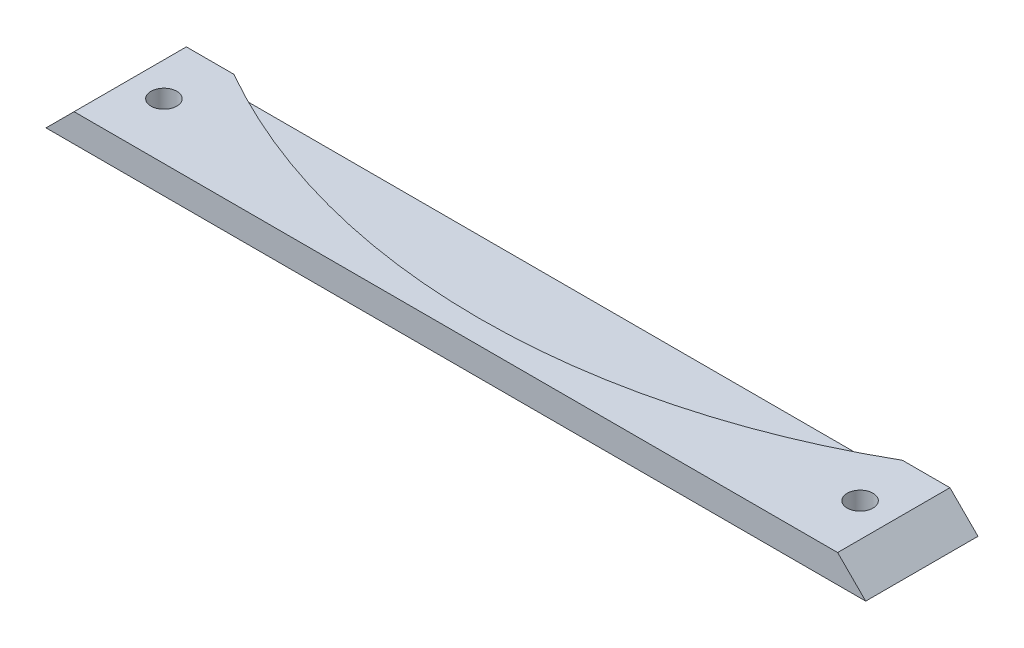
ISO-10303-21;
HEADER;
FILE_DESCRIPTION(('STEP AP214'),'2;1');
FILE_NAME('part.step','',(''),(''),'','','');
FILE_SCHEMA(('AUTOMOTIVE_DESIGN { 1 0 10303 214 1 1 1 1 }'));
ENDSEC;
DATA;
#1=APPLICATION_CONTEXT('core data for automotive mechanical design processes');
#2=APPLICATION_PROTOCOL_DEFINITION('international standard','automotive_design',2000,#1);
#3=PRODUCT_CONTEXT('',#1,'mechanical');
#4=PRODUCT('Part','Part','',(#3));
#5=PRODUCT_RELATED_PRODUCT_CATEGORY('part','',(#4));
#6=PRODUCT_DEFINITION_FORMATION('','',#4);
#7=PRODUCT_DEFINITION_CONTEXT('part definition',#1,'design');
#8=PRODUCT_DEFINITION('design','',#6,#7);
#9=PRODUCT_DEFINITION_SHAPE('','',#8);
#10=(LENGTH_UNIT() NAMED_UNIT(*) SI_UNIT(.MILLI.,.METRE.));
#11=(NAMED_UNIT(*) PLANE_ANGLE_UNIT() SI_UNIT($,.RADIAN.));
#12=(NAMED_UNIT(*) SI_UNIT($,.STERADIAN.) SOLID_ANGLE_UNIT());
#13=UNCERTAINTY_MEASURE_WITH_UNIT(LENGTH_MEASURE(1.E-05),#10,'distance_accuracy_value','');
#14=(GEOMETRIC_REPRESENTATION_CONTEXT(3) GLOBAL_UNCERTAINTY_ASSIGNED_CONTEXT((#13)) GLOBAL_UNIT_ASSIGNED_CONTEXT((#10,
#11,#12)) REPRESENTATION_CONTEXT('',''));
#15=CARTESIAN_POINT('',(0.,0.,0.));
#16=DIRECTION('',(0.,0.,1.));
#17=DIRECTION('',(1.,0.,0.));
#18=AXIS2_PLACEMENT_3D('',#15,#16,#17);
#19=CARTESIAN_POINT('',(-75.,5.,-10.));
#20=DIRECTION('',(0.,0.,1.));
#21=DIRECTION('',(1.,0.,0.));
#22=AXIS2_PLACEMENT_3D('',#19,#20,#21);
#23=PLANE('',#22);
#24=DIRECTION('',(-1.,0.,0.));
#25=VECTOR('',#24,1.);
#26=CARTESIAN_POINT('',(-75.,5.,-10.));
#27=LINE('',#26,#25);
#28=CARTESIAN_POINT('',(67.9999999999999,5.,-10.));
#29=VERTEX_POINT('',#28);
#30=CARTESIAN_POINT('',(59.5442692456629,5.,-9.99999999999999));
#31=VERTEX_POINT('',#30);
#32=EDGE_CURVE('E141',#29,#31,#27,.T.);
#33=ORIENTED_EDGE('',*,*,#32,.F.);
#34=DIRECTION('',(-0.707106781186551,0.707106781186544,0.));
#35=VECTOR('',#34,1.);
#36=CARTESIAN_POINT('',(67.9999999999999,5.,-10.));
#37=LINE('',#36,#35);
#38=CARTESIAN_POINT('',(73.,0.,-10.));
#39=VERTEX_POINT('',#38);
#40=EDGE_CURVE('E121',#29,#39,#37,.F.);
#41=ORIENTED_EDGE('',*,*,#40,.T.);
#42=DIRECTION('',(-1.,0.,0.));
#43=VECTOR('',#42,1.);
#44=CARTESIAN_POINT('',(-75.,0.,-10.));
#45=LINE('',#44,#43);
#46=CARTESIAN_POINT('',(-72.9999999999999,0.,-10.));
#47=VERTEX_POINT('',#46);
#48=EDGE_CURVE('E99',#39,#47,#45,.T.);
#49=ORIENTED_EDGE('',*,*,#48,.T.);
#50=DIRECTION('',(-0.707106781186551,-0.707106781186544,0.));
#51=VECTOR('',#50,1.);
#52=CARTESIAN_POINT('',(-67.9999999999999,5.,-10.));
#53=LINE('',#52,#51);
#54=CARTESIAN_POINT('',(-67.9999999999999,5.,-10.));
#55=VERTEX_POINT('',#54);
#56=EDGE_CURVE('E119',#47,#55,#53,.F.);
#57=ORIENTED_EDGE('',*,*,#56,.T.);
#58=CARTESIAN_POINT('',(-59.5442692456629,5.,-9.99999999999999));
#59=VERTEX_POINT('',#58);
#60=EDGE_CURVE('E138',#59,#55,#27,.T.);
#61=ORIENTED_EDGE('',*,*,#60,.F.);
#62=DIRECTION('',(0.,1.,0.));
#63=VECTOR('',#62,1.);
#64=CARTESIAN_POINT('',(-59.5442692456629,2.,-9.99999999999999));
#65=LINE('',#64,#63);
#66=CARTESIAN_POINT('',(-59.5442692456629,2.,-9.99999999999999));
#67=VERTEX_POINT('',#66);
#68=EDGE_CURVE('E100',#59,#67,#65,.F.);
#69=ORIENTED_EDGE('',*,*,#68,.T.);
#70=DIRECTION('',(-1.,0.,0.));
#71=VECTOR('',#70,1.);
#72=CARTESIAN_POINT('',(-75.,2.,-10.));
#73=LINE('',#72,#71);
#74=CARTESIAN_POINT('',(59.5442692456629,2.,-9.99999999999999));
#75=VERTEX_POINT('',#74);
#76=EDGE_CURVE('E104',#75,#67,#73,.T.);
#77=ORIENTED_EDGE('',*,*,#76,.F.);
#78=DIRECTION('',(0.,1.,0.));
#79=VECTOR('',#78,1.);
#80=CARTESIAN_POINT('',(59.5442692456629,2.,-9.99999999999999));
#81=LINE('',#80,#79);
#82=EDGE_CURVE('E89',#75,#31,#81,.T.);
#83=ORIENTED_EDGE('',*,*,#82,.T.);
#84=EDGE_LOOP('',(#33,#41,#49,#57,#61,#69,#77,#83));
#85=FACE_BOUND('',#84,.T.);
#86=ADVANCED_FACE('F35',(#85),#23,.F.);
#87=CARTESIAN_POINT('',(-75.,5.,10.));
#88=DIRECTION('',(0.,0.,-1.));
#89=DIRECTION('',(-1.,0.,0.));
#90=AXIS2_PLACEMENT_3D('',#87,#88,#89);
#91=PLANE('',#90);
#92=DIRECTION('',(1.,0.,0.));
#93=VECTOR('',#92,1.);
#94=CARTESIAN_POINT('',(-75.,0.,10.));
#95=LINE('',#94,#93);
#96=CARTESIAN_POINT('',(-72.9999999999999,0.,10.));
#97=VERTEX_POINT('',#96);
#98=CARTESIAN_POINT('',(73.,0.,10.));
#99=VERTEX_POINT('',#98);
#100=EDGE_CURVE('E128',#97,#99,#95,.T.);
#101=ORIENTED_EDGE('',*,*,#100,.T.);
#102=DIRECTION('',(0.707106781186551,-0.707106781186544,0.));
#103=VECTOR('',#102,1.);
#104=CARTESIAN_POINT('',(67.9999999999999,5.,10.));
#105=LINE('',#104,#103);
#106=CARTESIAN_POINT('',(67.9999999999999,5.,10.));
#107=VERTEX_POINT('',#106);
#108=EDGE_CURVE('E11',#99,#107,#105,.F.);
#109=ORIENTED_EDGE('',*,*,#108,.T.);
#110=DIRECTION('',(1.,0.,0.));
#111=VECTOR('',#110,1.);
#112=CARTESIAN_POINT('',(-75.,5.,10.));
#113=LINE('',#112,#111);
#114=CARTESIAN_POINT('',(-67.9999999999999,5.,10.));
#115=VERTEX_POINT('',#114);
#116=EDGE_CURVE('E113',#115,#107,#113,.T.);
#117=ORIENTED_EDGE('',*,*,#116,.F.);
#118=DIRECTION('',(0.707106781186551,0.707106781186544,0.));
#119=VECTOR('',#118,1.);
#120=CARTESIAN_POINT('',(-67.9999999999999,5.,10.));
#121=LINE('',#120,#119);
#122=EDGE_CURVE('E44',#115,#97,#121,.F.);
#123=ORIENTED_EDGE('',*,*,#122,.T.);
#124=EDGE_LOOP('',(#101,#109,#117,#123));
#125=FACE_BOUND('',#124,.T.);
#126=ADVANCED_FACE('F139',(#125),#91,.F.);
#127=CARTESIAN_POINT('',(0.,5.,0.));
#128=DIRECTION('',(0.,-1.,0.));
#129=DIRECTION('',(0.,0.,-1.));
#130=AXIS2_PLACEMENT_3D('',#127,#128,#129);
#131=PLANE('',#130);
#132=CARTESIAN_POINT('',(-62.,5.,0.));
#133=DIRECTION('',(0.,1.,0.));
#134=DIRECTION('',(0.,0.,1.));
#135=AXIS2_PLACEMENT_3D('',#132,#133,#134);
#136=CIRCLE('',#135,2.29999999999999);
#137=CARTESIAN_POINT('',(-62.,5.,2.29999999999999));
#138=VERTEX_POINT('',#137);
#139=EDGE_CURVE('E105',#138,#138,#136,.T.);
#140=ORIENTED_EDGE('',*,*,#139,.F.);
#141=EDGE_LOOP('',(#140));
#142=FACE_BOUND('',#141,.T.);
#143=CARTESIAN_POINT('',(62.,5.,0.));
#144=DIRECTION('',(0.,1.,0.));
#145=DIRECTION('',(0.,0.,1.));
#146=AXIS2_PLACEMENT_3D('',#143,#144,#145);
#147=CIRCLE('',#146,2.29999999999999);
#148=CARTESIAN_POINT('',(62.,5.,2.29999999999999));
#149=VERTEX_POINT('',#148);
#150=EDGE_CURVE('E180',#149,#149,#147,.T.);
#151=ORIENTED_EDGE('',*,*,#150,.F.);
#152=EDGE_LOOP('',(#151));
#153=FACE_BOUND('',#152,.T.);
#154=ORIENTED_EDGE('',*,*,#116,.T.);
#155=DIRECTION('',(0.,0.,-1.));
#156=VECTOR('',#155,1.);
#157=CARTESIAN_POINT('',(67.9999999999999,5.,0.));
#158=LINE('',#157,#156);
#159=EDGE_CURVE('E111',#107,#29,#158,.T.);
#160=ORIENTED_EDGE('',*,*,#159,.T.);
#161=ORIENTED_EDGE('',*,*,#32,.T.);
#162=CARTESIAN_POINT('',(0.,5.,-114.3));
#163=DIRECTION('',(0.,-1.,0.));
#164=DIRECTION('',(0.,0.,-1.));
#165=AXIS2_PLACEMENT_3D('',#162,#163,#164);
#166=CIRCLE('',#165,120.1);
#167=EDGE_CURVE('E95',#31,#59,#166,.T.);
#168=ORIENTED_EDGE('',*,*,#167,.T.);
#169=ORIENTED_EDGE('',*,*,#60,.T.);
#170=DIRECTION('',(0.,0.,1.));
#171=VECTOR('',#170,1.);
#172=CARTESIAN_POINT('',(-67.9999999999999,5.,0.));
#173=LINE('',#172,#171);
#174=EDGE_CURVE('E108',#55,#115,#173,.T.);
#175=ORIENTED_EDGE('',*,*,#174,.T.);
#176=EDGE_LOOP('',(#154,#160,#161,#168,#169,#175));
#177=FACE_BOUND('',#176,.T.);
#178=ADVANCED_FACE('F136',(#142,#153,#177),#131,.F.);
#179=CARTESIAN_POINT('',(0.,0.,0.));
#180=DIRECTION('',(0.,-1.,0.));
#181=DIRECTION('',(0.,0.,-1.));
#182=AXIS2_PLACEMENT_3D('',#179,#180,#181);
#183=PLANE('',#182);
#184=CARTESIAN_POINT('',(-62.,0.,0.));
#185=DIRECTION('',(0.,1.,0.));
#186=DIRECTION('',(0.,0.,1.));
#187=AXIS2_PLACEMENT_3D('',#184,#185,#186);
#188=CIRCLE('',#187,2.29999999999999);
#189=CARTESIAN_POINT('',(-62.,0.,2.29999999999999));
#190=VERTEX_POINT('',#189);
#191=EDGE_CURVE('E186',#190,#190,#188,.T.);
#192=ORIENTED_EDGE('',*,*,#191,.T.);
#193=EDGE_LOOP('',(#192));
#194=FACE_BOUND('',#193,.T.);
#195=CARTESIAN_POINT('',(62.,0.,0.));
#196=DIRECTION('',(0.,1.,0.));
#197=DIRECTION('',(0.,0.,1.));
#198=AXIS2_PLACEMENT_3D('',#195,#196,#197);
#199=CIRCLE('',#198,2.29999999999999);
#200=CARTESIAN_POINT('',(62.,0.,2.29999999999999));
#201=VERTEX_POINT('',#200);
#202=EDGE_CURVE('E183',#201,#201,#199,.T.);
#203=ORIENTED_EDGE('',*,*,#202,.T.);
#204=EDGE_LOOP('',(#203));
#205=FACE_BOUND('',#204,.T.);
#206=ORIENTED_EDGE('',*,*,#48,.F.);
#207=DIRECTION('',(0.,0.,-1.));
#208=VECTOR('',#207,1.);
#209=CARTESIAN_POINT('',(73.,0.,0.));
#210=LINE('',#209,#208);
#211=EDGE_CURVE('E51',#39,#99,#210,.F.);
#212=ORIENTED_EDGE('',*,*,#211,.T.);
#213=ORIENTED_EDGE('',*,*,#100,.F.);
#214=DIRECTION('',(0.,0.,1.));
#215=VECTOR('',#214,1.);
#216=CARTESIAN_POINT('',(-72.9999999999999,0.,0.));
#217=LINE('',#216,#215);
#218=EDGE_CURVE('E123',#97,#47,#217,.F.);
#219=ORIENTED_EDGE('',*,*,#218,.T.);
#220=EDGE_LOOP('',(#206,#212,#213,#219));
#221=FACE_BOUND('',#220,.T.);
#222=ADVANCED_FACE('F127',(#194,#205,#221),#183,.T.);
#223=CARTESIAN_POINT('',(0.,2.,-114.3));
#224=DIRECTION('',(0.,1.,0.));
#225=DIRECTION('',(0.,0.,1.));
#226=AXIS2_PLACEMENT_3D('',#223,#224,#225);
#227=PLANE('',#226);
#228=ORIENTED_EDGE('',*,*,#76,.T.);
#229=CARTESIAN_POINT('',(0.,2.,-114.3));
#230=DIRECTION('',(0.,1.,0.));
#231=DIRECTION('',(0.,0.,1.));
#232=AXIS2_PLACEMENT_3D('',#229,#230,#231);
#233=CIRCLE('',#232,120.1);
#234=EDGE_CURVE('E92',#67,#75,#233,.T.);
#235=ORIENTED_EDGE('',*,*,#234,.T.);
#236=EDGE_LOOP('',(#228,#235));
#237=FACE_BOUND('',#236,.T.);
#238=ADVANCED_FACE('F103',(#237),#227,.T.);
#239=CARTESIAN_POINT('',(0.,2.,-114.3));
#240=DIRECTION('',(0.,1.,0.));
#241=DIRECTION('',(0.,0.,1.));
#242=AXIS2_PLACEMENT_3D('',#239,#240,#241);
#243=CYLINDRICAL_SURFACE('',#242,120.1);
#244=ORIENTED_EDGE('',*,*,#234,.F.);
#245=ORIENTED_EDGE('',*,*,#68,.F.);
#246=ORIENTED_EDGE('',*,*,#167,.F.);
#247=ORIENTED_EDGE('',*,*,#82,.F.);
#248=EDGE_LOOP('',(#244,#245,#246,#247));
#249=FACE_BOUND('',#248,.T.);
#250=ADVANCED_FACE('F91',(#249),#243,.F.);
#251=CARTESIAN_POINT('',(62.,5.,0.));
#252=DIRECTION('',(0.,-1.,0.));
#253=DIRECTION('',(0.,0.,-1.));
#254=AXIS2_PLACEMENT_3D('',#251,#252,#253);
#255=CYLINDRICAL_SURFACE('',#254,2.29999999999999);
#256=ORIENTED_EDGE('',*,*,#150,.T.);
#257=EDGE_LOOP('',(#256));
#258=FACE_BOUND('',#257,.T.);
#259=ORIENTED_EDGE('',*,*,#202,.F.);
#260=EDGE_LOOP('',(#259));
#261=FACE_BOUND('',#260,.T.);
#262=ADVANCED_FACE('F152',(#258,#261),#255,.F.);
#263=CARTESIAN_POINT('',(-62.,5.,0.));
#264=DIRECTION('',(0.,-1.,0.));
#265=DIRECTION('',(0.,0.,-1.));
#266=AXIS2_PLACEMENT_3D('',#263,#264,#265);
#267=CYLINDRICAL_SURFACE('',#266,2.29999999999999);
#268=ORIENTED_EDGE('',*,*,#139,.T.);
#269=EDGE_LOOP('',(#268));
#270=FACE_BOUND('',#269,.T.);
#271=ORIENTED_EDGE('',*,*,#191,.F.);
#272=EDGE_LOOP('',(#271));
#273=FACE_BOUND('',#272,.T.);
#274=ADVANCED_FACE('F147',(#270,#273),#267,.F.);
#275=CARTESIAN_POINT('',(67.9999999999999,5.,0.));
#276=DIRECTION('',(-0.707106781186544,-0.707106781186551,0.));
#277=DIRECTION('',(0.,0.,-1.));
#278=AXIS2_PLACEMENT_3D('',#275,#276,#277);
#279=PLANE('',#278);
#280=ORIENTED_EDGE('',*,*,#108,.F.);
#281=ORIENTED_EDGE('',*,*,#211,.F.);
#282=ORIENTED_EDGE('',*,*,#40,.F.);
#283=ORIENTED_EDGE('',*,*,#159,.F.);
#284=EDGE_LOOP('',(#280,#281,#282,#283));
#285=FACE_BOUND('',#284,.T.);
#286=ADVANCED_FACE('F145',(#285),#279,.F.);
#287=CARTESIAN_POINT('',(-67.9999999999999,5.,0.));
#288=DIRECTION('',(0.707106781186544,-0.707106781186551,0.));
#289=DIRECTION('',(0.,0.,1.));
#290=AXIS2_PLACEMENT_3D('',#287,#288,#289);
#291=PLANE('',#290);
#292=ORIENTED_EDGE('',*,*,#56,.F.);
#293=ORIENTED_EDGE('',*,*,#218,.F.);
#294=ORIENTED_EDGE('',*,*,#122,.F.);
#295=ORIENTED_EDGE('',*,*,#174,.F.);
#296=EDGE_LOOP('',(#292,#293,#294,#295));
#297=FACE_BOUND('',#296,.T.);
#298=ADVANCED_FACE('F38',(#297),#291,.F.);
#299=CLOSED_SHELL('',(#86,#126,#178,#222,#238,#250,#262,#274,#286,#298));
#300=MANIFOLD_SOLID_BREP('B2',#299);
#301=ADVANCED_BREP_SHAPE_REPRESENTATION('',(#18,#300),#14);
#302=SHAPE_DEFINITION_REPRESENTATION(#9,#301);
ENDSEC;
END-ISO-10303-21;
